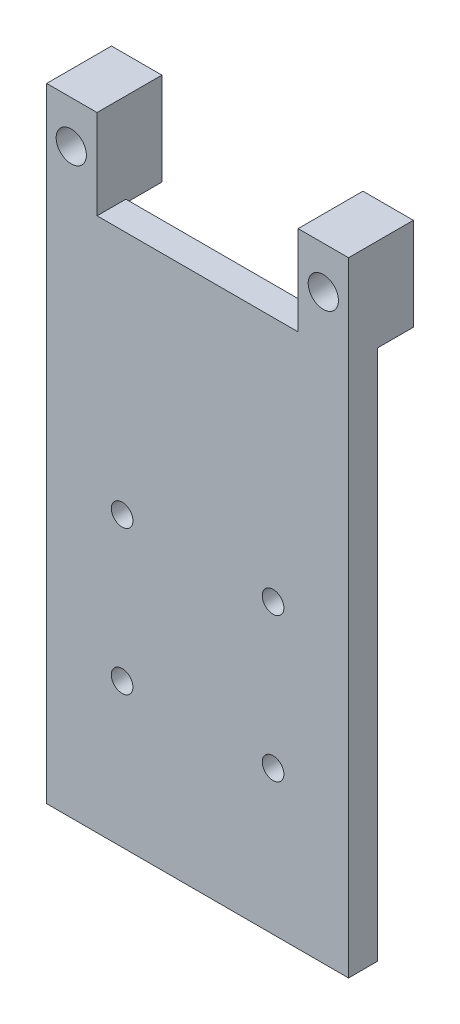
ISO-10303-21;
HEADER;
FILE_DESCRIPTION(('STEP AP214'),'2;1');
FILE_NAME('part.step','',(''),(''),'','','');
FILE_SCHEMA(('AUTOMOTIVE_DESIGN { 1 0 10303 214 1 1 1 1 }'));
ENDSEC;
DATA;
#1=APPLICATION_CONTEXT('core data for automotive mechanical design processes');
#2=APPLICATION_PROTOCOL_DEFINITION('international standard','automotive_design',2000,#1);
#3=PRODUCT_CONTEXT('',#1,'mechanical');
#4=PRODUCT('Part','Part','',(#3));
#5=PRODUCT_RELATED_PRODUCT_CATEGORY('part','',(#4));
#6=PRODUCT_DEFINITION_FORMATION('','',#4);
#7=PRODUCT_DEFINITION_CONTEXT('part definition',#1,'design');
#8=PRODUCT_DEFINITION('design','',#6,#7);
#9=PRODUCT_DEFINITION_SHAPE('','',#8);
#10=(LENGTH_UNIT() NAMED_UNIT(*) SI_UNIT(.MILLI.,.METRE.));
#11=(NAMED_UNIT(*) PLANE_ANGLE_UNIT() SI_UNIT($,.RADIAN.));
#12=(NAMED_UNIT(*) SI_UNIT($,.STERADIAN.) SOLID_ANGLE_UNIT());
#13=UNCERTAINTY_MEASURE_WITH_UNIT(LENGTH_MEASURE(1.E-05),#10,'distance_accuracy_value','');
#14=(GEOMETRIC_REPRESENTATION_CONTEXT(3) GLOBAL_UNCERTAINTY_ASSIGNED_CONTEXT((#13)) GLOBAL_UNIT_ASSIGNED_CONTEXT((#10,
#11,#12)) REPRESENTATION_CONTEXT('',''));
#15=CARTESIAN_POINT('',(0.,0.,0.));
#16=DIRECTION('',(0.,0.,1.));
#17=DIRECTION('',(1.,0.,0.));
#18=AXIS2_PLACEMENT_3D('',#15,#16,#17);
#19=CARTESIAN_POINT('',(0.,0.,0.));
#20=DIRECTION('',(0.,0.,1.));
#21=DIRECTION('',(1.,0.,0.));
#22=AXIS2_PLACEMENT_3D('',#19,#20,#21);
#23=PLANE('',#22);
#24=CARTESIAN_POINT('',(0.372099498728424,-1100.6150076543,0.));
#25=DIRECTION('',(0.,0.,1.));
#26=DIRECTION('',(1.,0.,0.));
#27=AXIS2_PLACEMENT_3D('',#24,#25,#26);
#28=CIRCLE('',#27,1.49999999999997);
#29=CARTESIAN_POINT('',(1.87209949872839,-1100.6150076543,0.));
#30=VERTEX_POINT('',#29);
#31=EDGE_CURVE('E250',#30,#30,#28,.T.);
#32=ORIENTED_EDGE('',*,*,#31,.T.);
#33=EDGE_LOOP('',(#32));
#34=FACE_BOUND('',#33,.T.);
#35=CARTESIAN_POINT('',(21.3299621030825,-1100.61988518188,0.));
#36=DIRECTION('',(0.,0.,1.));
#37=DIRECTION('',(1.,0.,0.));
#38=AXIS2_PLACEMENT_3D('',#35,#36,#37);
#39=CIRCLE('',#38,1.49999999999997);
#40=CARTESIAN_POINT('',(22.8299621030825,-1100.61988518188,0.));
#41=VERTEX_POINT('',#40);
#42=EDGE_CURVE('E255',#41,#41,#39,.T.);
#43=ORIENTED_EDGE('',*,*,#42,.T.);
#44=EDGE_LOOP('',(#43));
#45=FACE_BOUND('',#44,.T.);
#46=CARTESIAN_POINT('',(21.3299621030825,-1120.61988518188,0.));
#47=DIRECTION('',(0.,0.,1.));
#48=DIRECTION('',(1.,0.,0.));
#49=AXIS2_PLACEMENT_3D('',#46,#47,#48);
#50=CIRCLE('',#49,1.49999999999997);
#51=CARTESIAN_POINT('',(22.8299621030825,-1120.61988518188,0.));
#52=VERTEX_POINT('',#51);
#53=EDGE_CURVE('E239',#52,#52,#50,.T.);
#54=ORIENTED_EDGE('',*,*,#53,.T.);
#55=EDGE_LOOP('',(#54));
#56=FACE_BOUND('',#55,.T.);
#57=CARTESIAN_POINT('',(0.372099498728424,-1120.61988518188,0.));
#58=DIRECTION('',(0.,0.,1.));
#59=DIRECTION('',(1.,0.,0.));
#60=AXIS2_PLACEMENT_3D('',#57,#58,#59);
#61=CIRCLE('',#60,1.49999999999997);
#62=CARTESIAN_POINT('',(1.87209949872839,-1120.61988518188,0.));
#63=VERTEX_POINT('',#62);
#64=EDGE_CURVE('E243',#63,#63,#61,.T.);
#65=ORIENTED_EDGE('',*,*,#64,.T.);
#66=EDGE_LOOP('',(#65));
#67=FACE_BOUND('',#66,.T.);
#68=DIRECTION('',(-1.,0.,0.));
#69=VECTOR('',#68,1.);
#70=CARTESIAN_POINT('',(-10.1068318034486,-1066.86988518188,0.));
#71=LINE('',#70,#69);
#72=CARTESIAN_POINT('',(-3.10683180344861,-1066.86988518188,0.));
#73=VERTEX_POINT('',#72);
#74=CARTESIAN_POINT('',(-10.1068318034486,-1066.86988518188,0.));
#75=VERTEX_POINT('',#74);
#76=EDGE_CURVE('E156',#73,#75,#71,.T.);
#77=ORIENTED_EDGE('',*,*,#76,.F.);
#78=DIRECTION('',(0.,-1.,0.));
#79=VECTOR('',#78,1.);
#80=CARTESIAN_POINT('',(-3.10683180344861,-1066.86988518188,0.));
#81=LINE('',#80,#79);
#82=CARTESIAN_POINT('',(-3.10683180344862,-1066.4230018018,0.));
#83=VERTEX_POINT('',#82);
#84=EDGE_CURVE('E11',#83,#73,#81,.T.);
#85=ORIENTED_EDGE('',*,*,#84,.F.);
#86=DIRECTION('',(-1.,0.,0.));
#87=VECTOR('',#86,1.);
#88=CARTESIAN_POINT('',(24.8088934052596,-1066.4230018018,0.));
#89=LINE('',#88,#87);
#90=CARTESIAN_POINT('',(24.8088934052596,-1066.4230018018,0.));
#91=VERTEX_POINT('',#90);
#92=EDGE_CURVE('E170',#91,#83,#89,.T.);
#93=ORIENTED_EDGE('',*,*,#92,.F.);
#94=DIRECTION('',(0.,1.,0.));
#95=VECTOR('',#94,1.);
#96=CARTESIAN_POINT('',(24.8088934052596,-1054.0032400439,0.));
#97=LINE('',#96,#95);
#98=CARTESIAN_POINT('',(24.8088934052596,-1066.86988518188,0.));
#99=VERTEX_POINT('',#98);
#100=EDGE_CURVE('E178',#99,#91,#97,.T.);
#101=ORIENTED_EDGE('',*,*,#100,.F.);
#102=DIRECTION('',(-1.,0.,0.));
#103=VECTOR('',#102,1.);
#104=CARTESIAN_POINT('',(31.8088934052596,-1066.86988518188,0.));
#105=LINE('',#104,#103);
#106=CARTESIAN_POINT('',(31.8088934052596,-1066.86988518188,0.));
#107=VERTEX_POINT('',#106);
#108=EDGE_CURVE('E63',#107,#99,#105,.T.);
#109=ORIENTED_EDGE('',*,*,#108,.F.);
#110=DIRECTION('',(0.,1.,0.));
#111=VECTOR('',#110,1.);
#112=CARTESIAN_POINT('',(31.8088934052596,-1059.38058575217,0.));
#113=LINE('',#112,#111);
#114=CARTESIAN_POINT('',(31.8088934052596,-1140.61988518188,0.));
#115=VERTEX_POINT('',#114);
#116=EDGE_CURVE('E196',#115,#107,#113,.T.);
#117=ORIENTED_EDGE('',*,*,#116,.F.);
#118=DIRECTION('',(1.,0.,0.));
#119=VECTOR('',#118,1.);
#120=CARTESIAN_POINT('',(-10.1068318034486,-1140.61988518188,0.));
#121=LINE('',#120,#119);
#122=CARTESIAN_POINT('',(-10.1068318034486,-1140.61988518188,0.));
#123=VERTEX_POINT('',#122);
#124=EDGE_CURVE('E214',#123,#115,#121,.T.);
#125=ORIENTED_EDGE('',*,*,#124,.F.);
#126=DIRECTION('',(0.,-1.,0.));
#127=VECTOR('',#126,1.);
#128=CARTESIAN_POINT('',(-10.1068318034486,-1059.38058575217,0.));
#129=LINE('',#128,#127);
#130=EDGE_CURVE('E56',#75,#123,#129,.T.);
#131=ORIENTED_EDGE('',*,*,#130,.F.);
#132=EDGE_LOOP('',(#77,#85,#93,#101,#109,#117,#125,#131));
#133=FACE_BOUND('',#132,.T.);
#134=ADVANCED_FACE('F39',(#34,#45,#56,#67,#133),#23,.F.);
#135=CARTESIAN_POINT('',(31.8088934052596,-1054.0032400439,4.));
#136=DIRECTION('',(0.,-1.,0.));
#137=DIRECTION('',(0.,0.,-1.));
#138=AXIS2_PLACEMENT_3D('',#135,#136,#137);
#139=PLANE('',#138);
#140=DIRECTION('',(0.,0.,-1.));
#141=VECTOR('',#140,1.);
#142=CARTESIAN_POINT('',(31.8088934052596,-1054.0032400439,4.));
#143=LINE('',#142,#141);
#144=CARTESIAN_POINT('',(31.8088934052596,-1054.0032400439,4.));
#145=VERTEX_POINT('',#144);
#146=CARTESIAN_POINT('',(31.8088934052596,-1054.0032400439,-5.));
#147=VERTEX_POINT('',#146);
#148=EDGE_CURVE('E48',#145,#147,#143,.T.);
#149=ORIENTED_EDGE('',*,*,#148,.T.);
#150=DIRECTION('',(1.,0.,0.));
#151=VECTOR('',#150,1.);
#152=CARTESIAN_POINT('',(31.8088934052596,-1054.0032400439,-5.));
#153=LINE('',#152,#151);
#154=CARTESIAN_POINT('',(24.8088934052596,-1054.0032400439,-5.));
#155=VERTEX_POINT('',#154);
#156=EDGE_CURVE('E177',#155,#147,#153,.T.);
#157=ORIENTED_EDGE('',*,*,#156,.F.);
#158=DIRECTION('',(0.,0.,-1.));
#159=VECTOR('',#158,1.);
#160=CARTESIAN_POINT('',(24.8088934052596,-1054.0032400439,4.));
#161=LINE('',#160,#159);
#162=CARTESIAN_POINT('',(24.8088934052596,-1054.0032400439,4.));
#163=VERTEX_POINT('',#162);
#164=EDGE_CURVE('E227',#163,#155,#161,.T.);
#165=ORIENTED_EDGE('',*,*,#164,.F.);
#166=DIRECTION('',(-1.,0.,0.));
#167=VECTOR('',#166,1.);
#168=CARTESIAN_POINT('',(31.8088934052596,-1054.0032400439,4.));
#169=LINE('',#168,#167);
#170=EDGE_CURVE('E195',#145,#163,#169,.T.);
#171=ORIENTED_EDGE('',*,*,#170,.F.);
#172=EDGE_LOOP('',(#149,#157,#165,#171));
#173=FACE_BOUND('',#172,.T.);
#174=ADVANCED_FACE('F41',(#173),#139,.F.);
#175=CARTESIAN_POINT('',(24.8088934052596,-1054.0032400439,4.));
#176=DIRECTION('',(1.,0.,0.));
#177=DIRECTION('',(0.,1.,0.));
#178=AXIS2_PLACEMENT_3D('',#175,#176,#177);
#179=PLANE('',#178);
#180=ORIENTED_EDGE('',*,*,#164,.T.);
#181=DIRECTION('',(0.,1.,0.));
#182=VECTOR('',#181,1.);
#183=CARTESIAN_POINT('',(24.8088934052596,-1054.0032400439,-5.));
#184=LINE('',#183,#182);
#185=CARTESIAN_POINT('',(24.8088934052596,-1066.86988518188,-5.));
#186=VERTEX_POINT('',#185);
#187=EDGE_CURVE('E185',#186,#155,#184,.T.);
#188=ORIENTED_EDGE('',*,*,#187,.F.);
#189=DIRECTION('',(0.,0.,1.));
#190=VECTOR('',#189,1.);
#191=CARTESIAN_POINT('',(24.8088934052596,-1066.86988518188,-5.));
#192=LINE('',#191,#190);
#193=EDGE_CURVE('E174',#186,#99,#192,.T.);
#194=ORIENTED_EDGE('',*,*,#193,.T.);
#195=ORIENTED_EDGE('',*,*,#100,.T.);
#196=DIRECTION('',(0.,0.,-1.));
#197=VECTOR('',#196,1.);
#198=CARTESIAN_POINT('',(24.8088934052596,-1066.4230018018,4.));
#199=LINE('',#198,#197);
#200=CARTESIAN_POINT('',(24.8088934052596,-1066.4230018018,4.));
#201=VERTEX_POINT('',#200);
#202=EDGE_CURVE('E225',#201,#91,#199,.T.);
#203=ORIENTED_EDGE('',*,*,#202,.F.);
#204=DIRECTION('',(0.,-1.,0.));
#205=VECTOR('',#204,1.);
#206=CARTESIAN_POINT('',(24.8088934052596,-1054.0032400439,4.));
#207=LINE('',#206,#205);
#208=EDGE_CURVE('E198',#163,#201,#207,.T.);
#209=ORIENTED_EDGE('',*,*,#208,.F.);
#210=EDGE_LOOP('',(#180,#188,#194,#195,#203,#209));
#211=FACE_BOUND('',#210,.T.);
#212=ADVANCED_FACE('F297',(#211),#179,.F.);
#213=CARTESIAN_POINT('',(24.8088934052596,-1066.4230018018,4.));
#214=DIRECTION('',(0.,-1.,0.));
#215=DIRECTION('',(0.,0.,-1.));
#216=AXIS2_PLACEMENT_3D('',#213,#214,#215);
#217=PLANE('',#216);
#218=ORIENTED_EDGE('',*,*,#92,.T.);
#219=DIRECTION('',(0.,0.,-1.));
#220=VECTOR('',#219,1.);
#221=CARTESIAN_POINT('',(-3.10683180344862,-1066.4230018018,4.));
#222=LINE('',#221,#220);
#223=CARTESIAN_POINT('',(-3.10683180344862,-1066.4230018018,4.));
#224=VERTEX_POINT('',#223);
#225=EDGE_CURVE('E222',#224,#83,#222,.T.);
#226=ORIENTED_EDGE('',*,*,#225,.F.);
#227=DIRECTION('',(-1.,0.,0.));
#228=VECTOR('',#227,1.);
#229=CARTESIAN_POINT('',(24.8088934052596,-1066.4230018018,4.));
#230=LINE('',#229,#228);
#231=EDGE_CURVE('E200',#201,#224,#230,.T.);
#232=ORIENTED_EDGE('',*,*,#231,.F.);
#233=ORIENTED_EDGE('',*,*,#202,.T.);
#234=EDGE_LOOP('',(#218,#226,#232,#233));
#235=FACE_BOUND('',#234,.T.);
#236=ADVANCED_FACE('F304',(#235),#217,.F.);
#237=CARTESIAN_POINT('',(-3.10683180344862,-1066.4230018018,4.));
#238=DIRECTION('',(-1.,0.,0.));
#239=DIRECTION('',(0.,-1.,0.));
#240=AXIS2_PLACEMENT_3D('',#237,#238,#239);
#241=PLANE('',#240);
#242=ORIENTED_EDGE('',*,*,#225,.T.);
#243=ORIENTED_EDGE('',*,*,#84,.T.);
#244=DIRECTION('',(0.,0.,1.));
#245=VECTOR('',#244,1.);
#246=CARTESIAN_POINT('',(-3.10683180344861,-1066.86988518188,-5.));
#247=LINE('',#246,#245);
#248=CARTESIAN_POINT('',(-3.10683180344861,-1066.86988518188,-5.));
#249=VERTEX_POINT('',#248);
#250=EDGE_CURVE('E167',#249,#73,#247,.T.);
#251=ORIENTED_EDGE('',*,*,#250,.F.);
#252=DIRECTION('',(0.,-1.,0.));
#253=VECTOR('',#252,1.);
#254=CARTESIAN_POINT('',(-3.10683180344861,-1066.86988518188,-5.));
#255=LINE('',#254,#253);
#256=CARTESIAN_POINT('',(-3.10683180344861,-1054.0032400439,-5.));
#257=VERTEX_POINT('',#256);
#258=EDGE_CURVE('E150',#257,#249,#255,.T.);
#259=ORIENTED_EDGE('',*,*,#258,.F.);
#260=DIRECTION('',(0.,0.,-1.));
#261=VECTOR('',#260,1.);
#262=CARTESIAN_POINT('',(-3.10683180344861,-1054.0032400439,4.));
#263=LINE('',#262,#261);
#264=CARTESIAN_POINT('',(-3.10683180344861,-1054.0032400439,4.));
#265=VERTEX_POINT('',#264);
#266=EDGE_CURVE('E141',#265,#257,#263,.T.);
#267=ORIENTED_EDGE('',*,*,#266,.F.);
#268=DIRECTION('',(0.,1.,0.));
#269=VECTOR('',#268,1.);
#270=CARTESIAN_POINT('',(-3.10683180344862,-1066.4230018018,4.));
#271=LINE('',#270,#269);
#272=EDGE_CURVE('E202',#224,#265,#271,.T.);
#273=ORIENTED_EDGE('',*,*,#272,.F.);
#274=EDGE_LOOP('',(#242,#243,#251,#259,#267,#273));
#275=FACE_BOUND('',#274,.T.);
#276=ADVANCED_FACE('F307',(#275),#241,.F.);
#277=CARTESIAN_POINT('',(-10.1068318034486,-1054.0032400439,4.));
#278=DIRECTION('',(0.,-1.,0.));
#279=DIRECTION('',(0.,0.,-1.));
#280=AXIS2_PLACEMENT_3D('',#277,#278,#279);
#281=PLANE('',#280);
#282=ORIENTED_EDGE('',*,*,#266,.T.);
#283=DIRECTION('',(1.,0.,0.));
#284=VECTOR('',#283,1.);
#285=CARTESIAN_POINT('',(-10.1068318034486,-1054.0032400439,-5.));
#286=LINE('',#285,#284);
#287=CARTESIAN_POINT('',(-10.1068318034486,-1054.0032400439,-5.));
#288=VERTEX_POINT('',#287);
#289=EDGE_CURVE('E145',#288,#257,#286,.T.);
#290=ORIENTED_EDGE('',*,*,#289,.F.);
#291=DIRECTION('',(0.,0.,-1.));
#292=VECTOR('',#291,1.);
#293=CARTESIAN_POINT('',(-10.1068318034486,-1054.0032400439,4.));
#294=LINE('',#293,#292);
#295=CARTESIAN_POINT('',(-10.1068318034486,-1054.0032400439,4.));
#296=VERTEX_POINT('',#295);
#297=EDGE_CURVE('E131',#296,#288,#294,.T.);
#298=ORIENTED_EDGE('',*,*,#297,.F.);
#299=DIRECTION('',(-1.,0.,0.));
#300=VECTOR('',#299,1.);
#301=CARTESIAN_POINT('',(-10.1068318034486,-1054.0032400439,4.));
#302=LINE('',#301,#300);
#303=EDGE_CURVE('E204',#265,#296,#302,.T.);
#304=ORIENTED_EDGE('',*,*,#303,.F.);
#305=EDGE_LOOP('',(#282,#290,#298,#304));
#306=FACE_BOUND('',#305,.T.);
#307=ADVANCED_FACE('F146',(#306),#281,.F.);
#308=CARTESIAN_POINT('',(-10.1068318034486,-1059.38058575217,4.));
#309=DIRECTION('',(1.,0.,0.));
#310=DIRECTION('',(0.,1.,0.));
#311=AXIS2_PLACEMENT_3D('',#308,#309,#310);
#312=PLANE('',#311);
#313=ORIENTED_EDGE('',*,*,#297,.T.);
#314=DIRECTION('',(0.,1.,0.));
#315=VECTOR('',#314,1.);
#316=CARTESIAN_POINT('',(-10.1068318034486,-1066.86988518188,-5.));
#317=LINE('',#316,#315);
#318=CARTESIAN_POINT('',(-10.1068318034486,-1066.86988518188,-5.));
#319=VERTEX_POINT('',#318);
#320=EDGE_CURVE('E136',#319,#288,#317,.T.);
#321=ORIENTED_EDGE('',*,*,#320,.F.);
#322=DIRECTION('',(0.,0.,1.));
#323=VECTOR('',#322,1.);
#324=CARTESIAN_POINT('',(-10.1068318034486,-1066.86988518188,-5.));
#325=LINE('',#324,#323);
#326=EDGE_CURVE('E164',#319,#75,#325,.T.);
#327=ORIENTED_EDGE('',*,*,#326,.T.);
#328=ORIENTED_EDGE('',*,*,#130,.T.);
#329=DIRECTION('',(0.,0.,-1.));
#330=VECTOR('',#329,1.);
#331=CARTESIAN_POINT('',(-10.1068318034486,-1140.61988518188,4.));
#332=LINE('',#331,#330);
#333=CARTESIAN_POINT('',(-10.1068318034486,-1140.61988518188,4.));
#334=VERTEX_POINT('',#333);
#335=EDGE_CURVE('E142',#334,#123,#332,.T.);
#336=ORIENTED_EDGE('',*,*,#335,.F.);
#337=DIRECTION('',(0.,-1.,0.));
#338=VECTOR('',#337,1.);
#339=CARTESIAN_POINT('',(-10.1068318034486,-1059.38058575217,4.));
#340=LINE('',#339,#338);
#341=EDGE_CURVE('E138',#296,#334,#340,.T.);
#342=ORIENTED_EDGE('',*,*,#341,.F.);
#343=EDGE_LOOP('',(#313,#321,#327,#328,#336,#342));
#344=FACE_BOUND('',#343,.T.);
#345=ADVANCED_FACE('F133',(#344),#312,.F.);
#346=CARTESIAN_POINT('',(-10.1068318034486,-1140.61988518188,4.));
#347=DIRECTION('',(0.,1.,0.));
#348=DIRECTION('',(0.,0.,1.));
#349=AXIS2_PLACEMENT_3D('',#346,#347,#348);
#350=PLANE('',#349);
#351=ORIENTED_EDGE('',*,*,#124,.T.);
#352=DIRECTION('',(0.,0.,-1.));
#353=VECTOR('',#352,1.);
#354=CARTESIAN_POINT('',(31.8088934052596,-1140.61988518188,4.));
#355=LINE('',#354,#353);
#356=CARTESIAN_POINT('',(31.8088934052596,-1140.61988518188,4.));
#357=VERTEX_POINT('',#356);
#358=EDGE_CURVE('E210',#357,#115,#355,.T.);
#359=ORIENTED_EDGE('',*,*,#358,.F.);
#360=DIRECTION('',(1.,0.,0.));
#361=VECTOR('',#360,1.);
#362=CARTESIAN_POINT('',(-10.1068318034486,-1140.61988518188,4.));
#363=LINE('',#362,#361);
#364=EDGE_CURVE('E207',#334,#357,#363,.T.);
#365=ORIENTED_EDGE('',*,*,#364,.F.);
#366=ORIENTED_EDGE('',*,*,#335,.T.);
#367=EDGE_LOOP('',(#351,#359,#365,#366));
#368=FACE_BOUND('',#367,.T.);
#369=ADVANCED_FACE('F310',(#368),#350,.F.);
#370=CARTESIAN_POINT('',(31.8088934052596,-1059.38058575217,4.));
#371=DIRECTION('',(-1.,0.,0.));
#372=DIRECTION('',(0.,-1.,0.));
#373=AXIS2_PLACEMENT_3D('',#370,#371,#372);
#374=PLANE('',#373);
#375=ORIENTED_EDGE('',*,*,#116,.T.);
#376=DIRECTION('',(0.,0.,1.));
#377=VECTOR('',#376,1.);
#378=CARTESIAN_POINT('',(31.8088934052596,-1066.86988518188,-5.));
#379=LINE('',#378,#377);
#380=CARTESIAN_POINT('',(31.8088934052596,-1066.86988518188,-5.));
#381=VERTEX_POINT('',#380);
#382=EDGE_CURVE('E171',#381,#107,#379,.T.);
#383=ORIENTED_EDGE('',*,*,#382,.F.);
#384=DIRECTION('',(0.,-1.,0.));
#385=VECTOR('',#384,1.);
#386=CARTESIAN_POINT('',(31.8088934052596,-1054.0032400439,-5.));
#387=LINE('',#386,#385);
#388=EDGE_CURVE('E181',#147,#381,#387,.T.);
#389=ORIENTED_EDGE('',*,*,#388,.F.);
#390=ORIENTED_EDGE('',*,*,#148,.F.);
#391=DIRECTION('',(0.,1.,0.));
#392=VECTOR('',#391,1.);
#393=CARTESIAN_POINT('',(31.8088934052596,-1059.38058575217,4.));
#394=LINE('',#393,#392);
#395=EDGE_CURVE('E192',#357,#145,#394,.T.);
#396=ORIENTED_EDGE('',*,*,#395,.F.);
#397=ORIENTED_EDGE('',*,*,#358,.T.);
#398=EDGE_LOOP('',(#375,#383,#389,#390,#396,#397));
#399=FACE_BOUND('',#398,.T.);
#400=ADVANCED_FACE('F272',(#399),#374,.F.);
#401=CARTESIAN_POINT('',(0.,0.,4.));
#402=DIRECTION('',(0.,0.,1.));
#403=DIRECTION('',(1.,0.,0.));
#404=AXIS2_PLACEMENT_3D('',#401,#402,#403);
#405=PLANE('',#404);
#406=CARTESIAN_POINT('',(0.372099498728424,-1100.6150076543,4.));
#407=DIRECTION('',(0.,0.,1.));
#408=DIRECTION('',(1.,0.,0.));
#409=AXIS2_PLACEMENT_3D('',#406,#407,#408);
#410=CIRCLE('',#409,1.49999999999997);
#411=CARTESIAN_POINT('',(1.87209949872839,-1100.6150076543,4.));
#412=VERTEX_POINT('',#411);
#413=EDGE_CURVE('E258',#412,#412,#410,.T.);
#414=ORIENTED_EDGE('',*,*,#413,.F.);
#415=EDGE_LOOP('',(#414));
#416=FACE_BOUND('',#415,.T.);
#417=CARTESIAN_POINT('',(21.3299621030825,-1100.61988518188,4.));
#418=DIRECTION('',(0.,0.,1.));
#419=DIRECTION('',(1.,0.,0.));
#420=AXIS2_PLACEMENT_3D('',#417,#418,#419);
#421=CIRCLE('',#420,1.49999999999997);
#422=CARTESIAN_POINT('',(22.8299621030825,-1100.61988518188,4.));
#423=VERTEX_POINT('',#422);
#424=EDGE_CURVE('E259',#423,#423,#421,.T.);
#425=ORIENTED_EDGE('',*,*,#424,.F.);
#426=EDGE_LOOP('',(#425));
#427=FACE_BOUND('',#426,.T.);
#428=CARTESIAN_POINT('',(21.3299621030825,-1120.61988518188,4.));
#429=DIRECTION('',(0.,0.,1.));
#430=DIRECTION('',(1.,0.,0.));
#431=AXIS2_PLACEMENT_3D('',#428,#429,#430);
#432=CIRCLE('',#431,1.49999999999997);
#433=CARTESIAN_POINT('',(22.8299621030825,-1120.61988518188,4.));
#434=VERTEX_POINT('',#433);
#435=EDGE_CURVE('E246',#434,#434,#432,.T.);
#436=ORIENTED_EDGE('',*,*,#435,.F.);
#437=EDGE_LOOP('',(#436));
#438=FACE_BOUND('',#437,.T.);
#439=CARTESIAN_POINT('',(0.372099498728424,-1120.61988518188,4.));
#440=DIRECTION('',(0.,0.,1.));
#441=DIRECTION('',(1.,0.,0.));
#442=AXIS2_PLACEMENT_3D('',#439,#440,#441);
#443=CIRCLE('',#442,1.49999999999997);
#444=CARTESIAN_POINT('',(1.87209949872839,-1120.61988518188,4.));
#445=VERTEX_POINT('',#444);
#446=EDGE_CURVE('E247',#445,#445,#443,.T.);
#447=ORIENTED_EDGE('',*,*,#446,.F.);
#448=EDGE_LOOP('',(#447));
#449=FACE_BOUND('',#448,.T.);
#450=CARTESIAN_POINT('',(-6.69110659474043,-1059.86988518188,4.));
#451=DIRECTION('',(0.,0.,1.));
#452=DIRECTION('',(1.,0.,0.));
#453=AXIS2_PLACEMENT_3D('',#450,#451,#452);
#454=CIRCLE('',#453,2.10000000000002);
#455=CARTESIAN_POINT('',(-4.59110659474041,-1059.86988518188,4.));
#456=VERTEX_POINT('',#455);
#457=EDGE_CURVE('E231',#456,#456,#454,.T.);
#458=ORIENTED_EDGE('',*,*,#457,.F.);
#459=EDGE_LOOP('',(#458));
#460=FACE_BOUND('',#459,.T.);
#461=CARTESIAN_POINT('',(28.3088934052596,-1059.86988518188,4.));
#462=DIRECTION('',(0.,0.,1.));
#463=DIRECTION('',(1.,0.,0.));
#464=AXIS2_PLACEMENT_3D('',#461,#462,#463);
#465=CIRCLE('',#464,2.09999999999993);
#466=CARTESIAN_POINT('',(30.4088934052595,-1059.86988518188,4.));
#467=VERTEX_POINT('',#466);
#468=EDGE_CURVE('E160',#467,#467,#465,.T.);
#469=ORIENTED_EDGE('',*,*,#468,.F.);
#470=EDGE_LOOP('',(#469));
#471=FACE_BOUND('',#470,.T.);
#472=ORIENTED_EDGE('',*,*,#395,.T.);
#473=ORIENTED_EDGE('',*,*,#170,.T.);
#474=ORIENTED_EDGE('',*,*,#208,.T.);
#475=ORIENTED_EDGE('',*,*,#231,.T.);
#476=ORIENTED_EDGE('',*,*,#272,.T.);
#477=ORIENTED_EDGE('',*,*,#303,.T.);
#478=ORIENTED_EDGE('',*,*,#341,.T.);
#479=ORIENTED_EDGE('',*,*,#364,.T.);
#480=EDGE_LOOP('',(#472,#473,#474,#475,#476,#477,#478,#479));
#481=FACE_BOUND('',#480,.T.);
#482=ADVANCED_FACE('F268',(#416,#427,#438,#449,#460,#471,#481),#405,.T.);
#483=CARTESIAN_POINT('',(31.8088934052596,-1066.86988518188,-5.));
#484=DIRECTION('',(0.,1.,0.));
#485=DIRECTION('',(0.,0.,1.));
#486=AXIS2_PLACEMENT_3D('',#483,#484,#485);
#487=PLANE('',#486);
#488=ORIENTED_EDGE('',*,*,#108,.T.);
#489=ORIENTED_EDGE('',*,*,#193,.F.);
#490=DIRECTION('',(-1.,0.,0.));
#491=VECTOR('',#490,1.);
#492=CARTESIAN_POINT('',(31.8088934052596,-1066.86988518188,-5.));
#493=LINE('',#492,#491);
#494=EDGE_CURVE('E188',#381,#186,#493,.T.);
#495=ORIENTED_EDGE('',*,*,#494,.F.);
#496=ORIENTED_EDGE('',*,*,#382,.T.);
#497=EDGE_LOOP('',(#488,#489,#495,#496));
#498=FACE_BOUND('',#497,.T.);
#499=ADVANCED_FACE('F271',(#498),#487,.F.);
#500=CARTESIAN_POINT('',(0.,0.,-5.));
#501=DIRECTION('',(0.,0.,-1.));
#502=DIRECTION('',(-1.,0.,0.));
#503=AXIS2_PLACEMENT_3D('',#500,#501,#502);
#504=PLANE('',#503);
#505=CARTESIAN_POINT('',(28.3088934052596,-1059.86988518188,-5.));
#506=DIRECTION('',(0.,0.,-1.));
#507=DIRECTION('',(-1.,0.,0.));
#508=AXIS2_PLACEMENT_3D('',#505,#506,#507);
#509=CIRCLE('',#508,2.09999999999993);
#510=CARTESIAN_POINT('',(26.2088934052596,-1059.86988518188,-5.));
#511=VERTEX_POINT('',#510);
#512=EDGE_CURVE('E43',#511,#511,#509,.T.);
#513=ORIENTED_EDGE('',*,*,#512,.F.);
#514=EDGE_LOOP('',(#513));
#515=FACE_BOUND('',#514,.T.);
#516=ORIENTED_EDGE('',*,*,#388,.T.);
#517=ORIENTED_EDGE('',*,*,#494,.T.);
#518=ORIENTED_EDGE('',*,*,#187,.T.);
#519=ORIENTED_EDGE('',*,*,#156,.T.);
#520=EDGE_LOOP('',(#516,#517,#518,#519));
#521=FACE_BOUND('',#520,.T.);
#522=ADVANCED_FACE('F293',(#515,#521),#504,.T.);
#523=CARTESIAN_POINT('',(-10.1068318034486,-1066.86988518188,-5.));
#524=DIRECTION('',(0.,1.,0.));
#525=DIRECTION('',(0.,0.,1.));
#526=AXIS2_PLACEMENT_3D('',#523,#524,#525);
#527=PLANE('',#526);
#528=ORIENTED_EDGE('',*,*,#76,.T.);
#529=ORIENTED_EDGE('',*,*,#326,.F.);
#530=DIRECTION('',(-1.,0.,0.));
#531=VECTOR('',#530,1.);
#532=CARTESIAN_POINT('',(-10.1068318034486,-1066.86988518188,-5.));
#533=LINE('',#532,#531);
#534=EDGE_CURVE('E154',#249,#319,#533,.T.);
#535=ORIENTED_EDGE('',*,*,#534,.F.);
#536=ORIENTED_EDGE('',*,*,#250,.T.);
#537=EDGE_LOOP('',(#528,#529,#535,#536));
#538=FACE_BOUND('',#537,.T.);
#539=ADVANCED_FACE('F375',(#538),#527,.F.);
#540=CARTESIAN_POINT('',(0.,0.,-5.));
#541=DIRECTION('',(0.,0.,-1.));
#542=DIRECTION('',(-1.,0.,0.));
#543=AXIS2_PLACEMENT_3D('',#540,#541,#542);
#544=PLANE('',#543);
#545=CARTESIAN_POINT('',(-6.69110659474043,-1059.86988518188,-5.));
#546=DIRECTION('',(0.,0.,-1.));
#547=DIRECTION('',(-1.,0.,0.));
#548=AXIS2_PLACEMENT_3D('',#545,#546,#547);
#549=CIRCLE('',#548,2.10000000000002);
#550=CARTESIAN_POINT('',(-8.79110659474045,-1059.86988518188,-5.));
#551=VERTEX_POINT('',#550);
#552=EDGE_CURVE('E229',#551,#551,#549,.T.);
#553=ORIENTED_EDGE('',*,*,#552,.F.);
#554=EDGE_LOOP('',(#553));
#555=FACE_BOUND('',#554,.T.);
#556=ORIENTED_EDGE('',*,*,#320,.T.);
#557=ORIENTED_EDGE('',*,*,#289,.T.);
#558=ORIENTED_EDGE('',*,*,#258,.T.);
#559=ORIENTED_EDGE('',*,*,#534,.T.);
#560=EDGE_LOOP('',(#556,#557,#558,#559));
#561=FACE_BOUND('',#560,.T.);
#562=ADVANCED_FACE('F152',(#555,#561),#544,.T.);
#563=CARTESIAN_POINT('',(-6.69110659474043,-1059.86988518188,-6.));
#564=DIRECTION('',(0.,0.,1.));
#565=DIRECTION('',(1.,0.,0.));
#566=AXIS2_PLACEMENT_3D('',#563,#564,#565);
#567=CYLINDRICAL_SURFACE('',#566,2.10000000000002);
#568=ORIENTED_EDGE('',*,*,#552,.T.);
#569=EDGE_LOOP('',(#568));
#570=FACE_BOUND('',#569,.T.);
#571=ORIENTED_EDGE('',*,*,#457,.T.);
#572=EDGE_LOOP('',(#571));
#573=FACE_BOUND('',#572,.T.);
#574=ADVANCED_FACE('F393',(#570,#573),#567,.F.);
#575=CARTESIAN_POINT('',(28.3088934052596,-1059.86988518188,-6.));
#576=DIRECTION('',(0.,0.,1.));
#577=DIRECTION('',(1.,0.,0.));
#578=AXIS2_PLACEMENT_3D('',#575,#576,#577);
#579=CYLINDRICAL_SURFACE('',#578,2.09999999999993);
#580=ORIENTED_EDGE('',*,*,#512,.T.);
#581=EDGE_LOOP('',(#580));
#582=FACE_BOUND('',#581,.T.);
#583=ORIENTED_EDGE('',*,*,#468,.T.);
#584=EDGE_LOOP('',(#583));
#585=FACE_BOUND('',#584,.T.);
#586=ADVANCED_FACE('F402',(#582,#585),#579,.F.);
#587=CARTESIAN_POINT('',(0.372099498728424,-1120.61988518188,-6.));
#588=DIRECTION('',(0.,0.,1.));
#589=DIRECTION('',(1.,0.,0.));
#590=AXIS2_PLACEMENT_3D('',#587,#588,#589);
#591=CYLINDRICAL_SURFACE('',#590,1.49999999999997);
#592=ORIENTED_EDGE('',*,*,#446,.T.);
#593=EDGE_LOOP('',(#592));
#594=FACE_BOUND('',#593,.T.);
#595=ORIENTED_EDGE('',*,*,#64,.F.);
#596=EDGE_LOOP('',(#595));
#597=FACE_BOUND('',#596,.T.);
#598=ADVANCED_FACE('F410',(#594,#597),#591,.F.);
#599=CARTESIAN_POINT('',(21.3299621030825,-1120.61988518188,-6.));
#600=DIRECTION('',(0.,0.,1.));
#601=DIRECTION('',(1.,0.,0.));
#602=AXIS2_PLACEMENT_3D('',#599,#600,#601);
#603=CYLINDRICAL_SURFACE('',#602,1.49999999999997);
#604=ORIENTED_EDGE('',*,*,#435,.T.);
#605=EDGE_LOOP('',(#604));
#606=FACE_BOUND('',#605,.T.);
#607=ORIENTED_EDGE('',*,*,#53,.F.);
#608=EDGE_LOOP('',(#607));
#609=FACE_BOUND('',#608,.T.);
#610=ADVANCED_FACE('F418',(#606,#609),#603,.F.);
#611=CARTESIAN_POINT('',(21.3299621030825,-1100.61988518188,-6.));
#612=DIRECTION('',(0.,0.,1.));
#613=DIRECTION('',(1.,0.,0.));
#614=AXIS2_PLACEMENT_3D('',#611,#612,#613);
#615=CYLINDRICAL_SURFACE('',#614,1.49999999999997);
#616=ORIENTED_EDGE('',*,*,#424,.T.);
#617=EDGE_LOOP('',(#616));
#618=FACE_BOUND('',#617,.T.);
#619=ORIENTED_EDGE('',*,*,#42,.F.);
#620=EDGE_LOOP('',(#619));
#621=FACE_BOUND('',#620,.T.);
#622=ADVANCED_FACE('F426',(#618,#621),#615,.F.);
#623=CARTESIAN_POINT('',(0.372099498728424,-1100.6150076543,-6.));
#624=DIRECTION('',(0.,0.,1.));
#625=DIRECTION('',(1.,0.,0.));
#626=AXIS2_PLACEMENT_3D('',#623,#624,#625);
#627=CYLINDRICAL_SURFACE('',#626,1.49999999999997);
#628=ORIENTED_EDGE('',*,*,#413,.T.);
#629=EDGE_LOOP('',(#628));
#630=FACE_BOUND('',#629,.T.);
#631=ORIENTED_EDGE('',*,*,#31,.F.);
#632=EDGE_LOOP('',(#631));
#633=FACE_BOUND('',#632,.T.);
#634=ADVANCED_FACE('F265',(#630,#633),#627,.F.);
#635=CLOSED_SHELL('',(#134,#174,#212,#236,#276,#307,#345,#369,#400,#482,#499,#522,#539,#562,
#574,#586,#598,#610,#622,#634));
#636=MANIFOLD_SOLID_BREP('B2',#635);
#637=ADVANCED_BREP_SHAPE_REPRESENTATION('',(#18,#636),#14);
#638=SHAPE_DEFINITION_REPRESENTATION(#9,#637);
ENDSEC;
END-ISO-10303-21;
